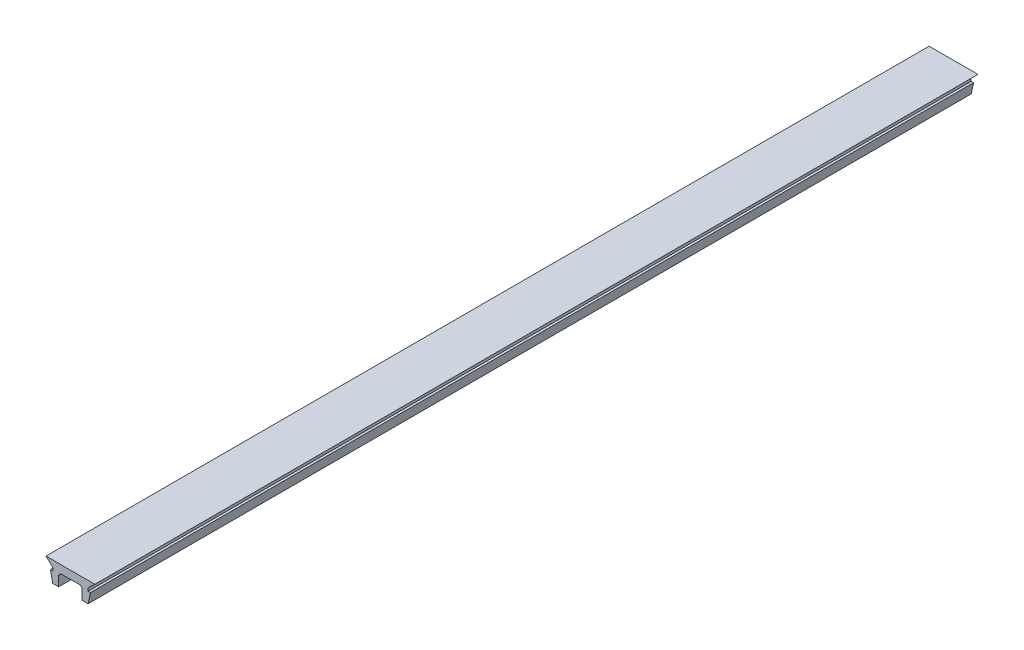
ISO-10303-21;
HEADER;
FILE_DESCRIPTION(('STEP AP214'),'2;1');
FILE_NAME('part.step','',(''),(''),'','','');
FILE_SCHEMA(('AUTOMOTIVE_DESIGN { 1 0 10303 214 1 1 1 1 }'));
ENDSEC;
DATA;
#1=APPLICATION_CONTEXT('core data for automotive mechanical design processes');
#2=APPLICATION_PROTOCOL_DEFINITION('international standard','automotive_design',2000,#1);
#3=PRODUCT_CONTEXT('',#1,'mechanical');
#4=PRODUCT('Part','Part','',(#3));
#5=PRODUCT_RELATED_PRODUCT_CATEGORY('part','',(#4));
#6=PRODUCT_DEFINITION_FORMATION('','',#4);
#7=PRODUCT_DEFINITION_CONTEXT('part definition',#1,'design');
#8=PRODUCT_DEFINITION('design','',#6,#7);
#9=PRODUCT_DEFINITION_SHAPE('','',#8);
#10=(LENGTH_UNIT() NAMED_UNIT(*) SI_UNIT(.MILLI.,.METRE.));
#11=(NAMED_UNIT(*) PLANE_ANGLE_UNIT() SI_UNIT($,.RADIAN.));
#12=(NAMED_UNIT(*) SI_UNIT($,.STERADIAN.) SOLID_ANGLE_UNIT());
#13=UNCERTAINTY_MEASURE_WITH_UNIT(LENGTH_MEASURE(1.E-05),#10,'distance_accuracy_value','');
#14=(GEOMETRIC_REPRESENTATION_CONTEXT(3) GLOBAL_UNCERTAINTY_ASSIGNED_CONTEXT((#13)) GLOBAL_UNIT_ASSIGNED_CONTEXT((#10,
#11,#12)) REPRESENTATION_CONTEXT('',''));
#15=CARTESIAN_POINT('',(0.,0.,0.));
#16=DIRECTION('',(0.,0.,1.));
#17=DIRECTION('',(1.,0.,0.));
#18=AXIS2_PLACEMENT_3D('',#15,#16,#17);
#19=CARTESIAN_POINT('',(-0.4,1.85,150.));
#20=DIRECTION('',(0.977414165439867,0.211332792527539,0.));
#21=DIRECTION('',(-0.211332792527539,0.977414165439867,0.));
#22=AXIS2_PLACEMENT_3D('',#19,#20,#21);
#23=PLANE('',#22);
#24=DIRECTION('',(0.211332792527539,-0.977414165439867,0.));
#25=VECTOR('',#24,1.);
#26=CARTESIAN_POINT('',(-0.4,1.85,0.));
#27=LINE('',#26,#25);
#28=CARTESIAN_POINT('',(-0.4,1.85,0.));
#29=VERTEX_POINT('',#28);
#30=CARTESIAN_POINT('',(0.,0.,0.));
#31=VERTEX_POINT('',#30);
#32=EDGE_CURVE('E188',#29,#31,#27,.T.);
#33=ORIENTED_EDGE('',*,*,#32,.T.);
#34=DIRECTION('',(0.,0.,-1.));
#35=VECTOR('',#34,1.);
#36=CARTESIAN_POINT('',(0.,0.,150.));
#37=LINE('',#36,#35);
#38=CARTESIAN_POINT('',(0.,0.,150.));
#39=VERTEX_POINT('',#38);
#40=EDGE_CURVE('E11',#39,#31,#37,.T.);
#41=ORIENTED_EDGE('',*,*,#40,.F.);
#42=DIRECTION('',(0.211332792527539,-0.977414165439867,0.));
#43=VECTOR('',#42,1.);
#44=CARTESIAN_POINT('',(-0.4,1.85,150.));
#45=LINE('',#44,#43);
#46=CARTESIAN_POINT('',(-0.4,1.85,150.));
#47=VERTEX_POINT('',#46);
#48=EDGE_CURVE('E235',#47,#39,#45,.T.);
#49=ORIENTED_EDGE('',*,*,#48,.F.);
#50=DIRECTION('',(0.,0.,-1.));
#51=VECTOR('',#50,1.);
#52=CARTESIAN_POINT('',(-0.4,1.85,150.));
#53=LINE('',#52,#51);
#54=EDGE_CURVE('E184',#47,#29,#53,.T.);
#55=ORIENTED_EDGE('',*,*,#54,.T.);
#56=EDGE_LOOP('',(#33,#41,#49,#55));
#57=FACE_BOUND('',#56,.T.);
#58=ADVANCED_FACE('F39',(#57),#23,.F.);
#59=CARTESIAN_POINT('',(0.,0.,150.));
#60=DIRECTION('',(0.,1.,0.));
#61=DIRECTION('',(0.,0.,1.));
#62=AXIS2_PLACEMENT_3D('',#59,#60,#61);
#63=PLANE('',#62);
#64=DIRECTION('',(1.,0.,0.));
#65=VECTOR('',#64,1.);
#66=CARTESIAN_POINT('',(0.,0.,0.));
#67=LINE('',#66,#65);
#68=CARTESIAN_POINT('',(1.,0.,0.));
#69=VERTEX_POINT('',#68);
#70=EDGE_CURVE('E192',#31,#69,#67,.T.);
#71=ORIENTED_EDGE('',*,*,#70,.T.);
#72=DIRECTION('',(0.,0.,-1.));
#73=VECTOR('',#72,1.);
#74=CARTESIAN_POINT('',(1.,0.,150.));
#75=LINE('',#74,#73);
#76=CARTESIAN_POINT('',(1.,0.,150.));
#77=VERTEX_POINT('',#76);
#78=EDGE_CURVE('E48',#77,#69,#75,.T.);
#79=ORIENTED_EDGE('',*,*,#78,.F.);
#80=DIRECTION('',(1.,0.,0.));
#81=VECTOR('',#80,1.);
#82=CARTESIAN_POINT('',(0.,0.,150.));
#83=LINE('',#82,#81);
#84=EDGE_CURVE('E123',#39,#77,#83,.T.);
#85=ORIENTED_EDGE('',*,*,#84,.F.);
#86=ORIENTED_EDGE('',*,*,#40,.T.);
#87=EDGE_LOOP('',(#71,#79,#85,#86));
#88=FACE_BOUND('',#87,.T.);
#89=ADVANCED_FACE('F356',(#88),#63,.F.);
#90=CARTESIAN_POINT('',(1.,0.,150.));
#91=DIRECTION('',(-1.,0.,0.));
#92=DIRECTION('',(0.,0.,1.));
#93=AXIS2_PLACEMENT_3D('',#90,#91,#92);
#94=PLANE('',#93);
#95=DIRECTION('',(0.,1.,0.));
#96=VECTOR('',#95,1.);
#97=CARTESIAN_POINT('',(1.,0.,0.));
#98=LINE('',#97,#96);
#99=CARTESIAN_POINT('',(1.,1.6,0.));
#100=VERTEX_POINT('',#99);
#101=EDGE_CURVE('E195',#69,#100,#98,.T.);
#102=ORIENTED_EDGE('',*,*,#101,.T.);
#103=DIRECTION('',(0.,0.,-1.));
#104=VECTOR('',#103,1.);
#105=CARTESIAN_POINT('',(1.,1.6,150.));
#106=LINE('',#105,#104);
#107=CARTESIAN_POINT('',(1.,1.6,150.));
#108=VERTEX_POINT('',#107);
#109=EDGE_CURVE('E278',#108,#100,#106,.T.);
#110=ORIENTED_EDGE('',*,*,#109,.F.);
#111=DIRECTION('',(0.,1.,0.));
#112=VECTOR('',#111,1.);
#113=CARTESIAN_POINT('',(1.,0.,150.));
#114=LINE('',#113,#112);
#115=EDGE_CURVE('E288',#77,#108,#114,.T.);
#116=ORIENTED_EDGE('',*,*,#115,.F.);
#117=ORIENTED_EDGE('',*,*,#78,.T.);
#118=EDGE_LOOP('',(#102,#110,#116,#117));
#119=FACE_BOUND('',#118,.T.);
#120=ADVANCED_FACE('F286',(#119),#94,.F.);
#121=CARTESIAN_POINT('',(1.5,1.6,150.));
#122=DIRECTION('',(0.,0.,-1.));
#123=DIRECTION('',(-1.,0.,0.));
#124=AXIS2_PLACEMENT_3D('',#121,#122,#123);
#125=CYLINDRICAL_SURFACE('',#124,0.5);
#126=CARTESIAN_POINT('',(1.5,1.6,0.));
#127=DIRECTION('',(0.,0.,-1.));
#128=DIRECTION('',(1.,0.,0.));
#129=AXIS2_PLACEMENT_3D('',#126,#127,#128);
#130=CIRCLE('',#129,0.5);
#131=CARTESIAN_POINT('',(1.5,2.1,0.));
#132=VERTEX_POINT('',#131);
#133=EDGE_CURVE('E198',#100,#132,#130,.T.);
#134=ORIENTED_EDGE('',*,*,#133,.T.);
#135=DIRECTION('',(0.,0.,-1.));
#136=VECTOR('',#135,1.);
#137=CARTESIAN_POINT('',(1.5,2.1,150.));
#138=LINE('',#137,#136);
#139=CARTESIAN_POINT('',(1.5,2.1,150.));
#140=VERTEX_POINT('',#139);
#141=EDGE_CURVE('E274',#140,#132,#138,.T.);
#142=ORIENTED_EDGE('',*,*,#141,.F.);
#143=CARTESIAN_POINT('',(1.5,1.6,150.));
#144=DIRECTION('',(0.,0.,-1.));
#145=DIRECTION('',(1.,0.,0.));
#146=AXIS2_PLACEMENT_3D('',#143,#144,#145);
#147=CIRCLE('',#146,0.5);
#148=EDGE_CURVE('E307',#108,#140,#147,.T.);
#149=ORIENTED_EDGE('',*,*,#148,.F.);
#150=ORIENTED_EDGE('',*,*,#109,.T.);
#151=EDGE_LOOP('',(#134,#142,#149,#150));
#152=FACE_BOUND('',#151,.T.);
#153=ADVANCED_FACE('F297',(#152),#125,.F.);
#154=CARTESIAN_POINT('',(1.5,2.1,150.));
#155=DIRECTION('',(0.,1.,0.));
#156=DIRECTION('',(0.,0.,1.));
#157=AXIS2_PLACEMENT_3D('',#154,#155,#156);
#158=PLANE('',#157);
#159=DIRECTION('',(1.,0.,0.));
#160=VECTOR('',#159,1.);
#161=CARTESIAN_POINT('',(1.5,2.1,0.));
#162=LINE('',#161,#160);
#163=CARTESIAN_POINT('',(4.5,2.1,0.));
#164=VERTEX_POINT('',#163);
#165=EDGE_CURVE('E201',#132,#164,#162,.T.);
#166=ORIENTED_EDGE('',*,*,#165,.T.);
#167=DIRECTION('',(0.,0.,-1.));
#168=VECTOR('',#167,1.);
#169=CARTESIAN_POINT('',(4.5,2.1,150.));
#170=LINE('',#169,#168);
#171=CARTESIAN_POINT('',(4.5,2.1,150.));
#172=VERTEX_POINT('',#171);
#173=EDGE_CURVE('E270',#172,#164,#170,.T.);
#174=ORIENTED_EDGE('',*,*,#173,.F.);
#175=DIRECTION('',(1.,0.,0.));
#176=VECTOR('',#175,1.);
#177=CARTESIAN_POINT('',(1.5,2.1,150.));
#178=LINE('',#177,#176);
#179=EDGE_CURVE('E303',#140,#172,#178,.T.);
#180=ORIENTED_EDGE('',*,*,#179,.F.);
#181=ORIENTED_EDGE('',*,*,#141,.T.);
#182=EDGE_LOOP('',(#166,#174,#180,#181));
#183=FACE_BOUND('',#182,.T.);
#184=ADVANCED_FACE('F301',(#183),#158,.F.);
#185=CARTESIAN_POINT('',(4.5,1.6,150.));
#186=DIRECTION('',(0.,0.,-1.));
#187=DIRECTION('',(-1.,0.,0.));
#188=AXIS2_PLACEMENT_3D('',#185,#186,#187);
#189=CYLINDRICAL_SURFACE('',#188,0.5);
#190=CARTESIAN_POINT('',(4.5,1.6,0.));
#191=DIRECTION('',(0.,0.,-1.));
#192=DIRECTION('',(-1.,0.,0.));
#193=AXIS2_PLACEMENT_3D('',#190,#191,#192);
#194=CIRCLE('',#193,0.5);
#195=CARTESIAN_POINT('',(5.,1.6,0.));
#196=VERTEX_POINT('',#195);
#197=EDGE_CURVE('E204',#164,#196,#194,.T.);
#198=ORIENTED_EDGE('',*,*,#197,.T.);
#199=DIRECTION('',(0.,0.,-1.));
#200=VECTOR('',#199,1.);
#201=CARTESIAN_POINT('',(5.,1.6,150.));
#202=LINE('',#201,#200);
#203=CARTESIAN_POINT('',(5.,1.6,150.));
#204=VERTEX_POINT('',#203);
#205=EDGE_CURVE('E266',#204,#196,#202,.T.);
#206=ORIENTED_EDGE('',*,*,#205,.F.);
#207=CARTESIAN_POINT('',(4.5,1.6,150.));
#208=DIRECTION('',(0.,0.,-1.));
#209=DIRECTION('',(-1.,0.,0.));
#210=AXIS2_PLACEMENT_3D('',#207,#208,#209);
#211=CIRCLE('',#210,0.5);
#212=EDGE_CURVE('E306',#172,#204,#211,.T.);
#213=ORIENTED_EDGE('',*,*,#212,.F.);
#214=ORIENTED_EDGE('',*,*,#173,.T.);
#215=EDGE_LOOP('',(#198,#206,#213,#214));
#216=FACE_BOUND('',#215,.T.);
#217=ADVANCED_FACE('F369',(#216),#189,.F.);
#218=CARTESIAN_POINT('',(5.,0.,150.));
#219=DIRECTION('',(1.,0.,0.));
#220=DIRECTION('',(0.,0.,-1.));
#221=AXIS2_PLACEMENT_3D('',#218,#219,#220);
#222=PLANE('',#221);
#223=DIRECTION('',(0.,-1.,0.));
#224=VECTOR('',#223,1.);
#225=CARTESIAN_POINT('',(5.,0.,0.));
#226=LINE('',#225,#224);
#227=CARTESIAN_POINT('',(5.,0.,0.));
#228=VERTEX_POINT('',#227);
#229=EDGE_CURVE('E207',#196,#228,#226,.T.);
#230=ORIENTED_EDGE('',*,*,#229,.T.);
#231=DIRECTION('',(0.,0.,-1.));
#232=VECTOR('',#231,1.);
#233=CARTESIAN_POINT('',(5.,0.,150.));
#234=LINE('',#233,#232);
#235=CARTESIAN_POINT('',(5.,0.,150.));
#236=VERTEX_POINT('',#235);
#237=EDGE_CURVE('E262',#236,#228,#234,.T.);
#238=ORIENTED_EDGE('',*,*,#237,.F.);
#239=DIRECTION('',(0.,-1.,0.));
#240=VECTOR('',#239,1.);
#241=CARTESIAN_POINT('',(5.,0.,150.));
#242=LINE('',#241,#240);
#243=EDGE_CURVE('E311',#204,#236,#242,.T.);
#244=ORIENTED_EDGE('',*,*,#243,.F.);
#245=ORIENTED_EDGE('',*,*,#205,.T.);
#246=EDGE_LOOP('',(#230,#238,#244,#245));
#247=FACE_BOUND('',#246,.T.);
#248=ADVANCED_FACE('F372',(#247),#222,.F.);
#249=CARTESIAN_POINT('',(5.,0.,150.));
#250=DIRECTION('',(0.,1.,0.));
#251=DIRECTION('',(0.,0.,1.));
#252=AXIS2_PLACEMENT_3D('',#249,#250,#251);
#253=PLANE('',#252);
#254=DIRECTION('',(1.,0.,0.));
#255=VECTOR('',#254,1.);
#256=CARTESIAN_POINT('',(5.,0.,0.));
#257=LINE('',#256,#255);
#258=CARTESIAN_POINT('',(6.,0.,0.));
#259=VERTEX_POINT('',#258);
#260=EDGE_CURVE('E210',#228,#259,#257,.T.);
#261=ORIENTED_EDGE('',*,*,#260,.T.);
#262=DIRECTION('',(0.,0.,-1.));
#263=VECTOR('',#262,1.);
#264=CARTESIAN_POINT('',(6.,0.,150.));
#265=LINE('',#264,#263);
#266=CARTESIAN_POINT('',(6.,0.,150.));
#267=VERTEX_POINT('',#266);
#268=EDGE_CURVE('E258',#267,#259,#265,.T.);
#269=ORIENTED_EDGE('',*,*,#268,.F.);
#270=DIRECTION('',(1.,0.,0.));
#271=VECTOR('',#270,1.);
#272=CARTESIAN_POINT('',(5.,0.,150.));
#273=LINE('',#272,#271);
#274=EDGE_CURVE('E318',#236,#267,#273,.T.);
#275=ORIENTED_EDGE('',*,*,#274,.F.);
#276=ORIENTED_EDGE('',*,*,#237,.T.);
#277=EDGE_LOOP('',(#261,#269,#275,#276));
#278=FACE_BOUND('',#277,.T.);
#279=ADVANCED_FACE('F376',(#278),#253,.F.);
#280=CARTESIAN_POINT('',(6.,0.,150.));
#281=DIRECTION('',(-0.977414165439867,0.211332792527539,0.));
#282=DIRECTION('',(-0.211332792527539,-0.977414165439867,0.));
#283=AXIS2_PLACEMENT_3D('',#280,#281,#282);
#284=PLANE('',#283);
#285=DIRECTION('',(0.211332792527539,0.977414165439867,0.));
#286=VECTOR('',#285,1.);
#287=CARTESIAN_POINT('',(6.,0.,0.));
#288=LINE('',#287,#286);
#289=CARTESIAN_POINT('',(6.4,1.85,0.));
#290=VERTEX_POINT('',#289);
#291=EDGE_CURVE('E213',#259,#290,#288,.T.);
#292=ORIENTED_EDGE('',*,*,#291,.T.);
#293=DIRECTION('',(0.,0.,-1.));
#294=VECTOR('',#293,1.);
#295=CARTESIAN_POINT('',(6.4,1.85,150.));
#296=LINE('',#295,#294);
#297=CARTESIAN_POINT('',(6.4,1.85,150.));
#298=VERTEX_POINT('',#297);
#299=EDGE_CURVE('E254',#298,#290,#296,.T.);
#300=ORIENTED_EDGE('',*,*,#299,.F.);
#301=DIRECTION('',(0.211332792527539,0.977414165439867,0.));
#302=VECTOR('',#301,1.);
#303=CARTESIAN_POINT('',(6.,0.,150.));
#304=LINE('',#303,#302);
#305=EDGE_CURVE('E321',#267,#298,#304,.T.);
#306=ORIENTED_EDGE('',*,*,#305,.F.);
#307=ORIENTED_EDGE('',*,*,#268,.T.);
#308=EDGE_LOOP('',(#292,#300,#306,#307));
#309=FACE_BOUND('',#308,.T.);
#310=ADVANCED_FACE('F380',(#309),#284,.F.);
#311=CARTESIAN_POINT('',(6.4,1.85,150.));
#312=DIRECTION('',(0.,-1.,0.));
#313=DIRECTION('',(1.,0.,0.));
#314=AXIS2_PLACEMENT_3D('',#311,#312,#313);
#315=PLANE('',#314);
#316=DIRECTION('',(-1.,0.,0.));
#317=VECTOR('',#316,1.);
#318=CARTESIAN_POINT('',(6.4,1.85,0.));
#319=LINE('',#318,#317);
#320=CARTESIAN_POINT('',(6.,1.85,0.));
#321=VERTEX_POINT('',#320);
#322=EDGE_CURVE('E216',#290,#321,#319,.T.);
#323=ORIENTED_EDGE('',*,*,#322,.T.);
#324=DIRECTION('',(0.,0.,-1.));
#325=VECTOR('',#324,1.);
#326=CARTESIAN_POINT('',(6.,1.85,150.));
#327=LINE('',#326,#325);
#328=CARTESIAN_POINT('',(6.,1.85,150.));
#329=VERTEX_POINT('',#328);
#330=EDGE_CURVE('E250',#329,#321,#327,.T.);
#331=ORIENTED_EDGE('',*,*,#330,.F.);
#332=DIRECTION('',(-1.,0.,0.));
#333=VECTOR('',#332,1.);
#334=CARTESIAN_POINT('',(6.4,1.85,150.));
#335=LINE('',#334,#333);
#336=EDGE_CURVE('E324',#298,#329,#335,.T.);
#337=ORIENTED_EDGE('',*,*,#336,.F.);
#338=ORIENTED_EDGE('',*,*,#299,.T.);
#339=EDGE_LOOP('',(#323,#331,#337,#338));
#340=FACE_BOUND('',#339,.T.);
#341=ADVANCED_FACE('F384',(#340),#315,.F.);
#342=CARTESIAN_POINT('',(6.,1.85,150.));
#343=DIRECTION('',(-1.,0.,0.));
#344=DIRECTION('',(0.,-1.,0.));
#345=AXIS2_PLACEMENT_3D('',#342,#343,#344);
#346=PLANE('',#345);
#347=DIRECTION('',(0.,1.,0.));
#348=VECTOR('',#347,1.);
#349=CARTESIAN_POINT('',(6.,1.85,0.));
#350=LINE('',#349,#348);
#351=CARTESIAN_POINT('',(6.,2.35,0.));
#352=VERTEX_POINT('',#351);
#353=EDGE_CURVE('E219',#321,#352,#350,.T.);
#354=ORIENTED_EDGE('',*,*,#353,.T.);
#355=DIRECTION('',(0.,0.,-1.));
#356=VECTOR('',#355,1.);
#357=CARTESIAN_POINT('',(6.,2.35,150.));
#358=LINE('',#357,#356);
#359=CARTESIAN_POINT('',(6.,2.35,150.));
#360=VERTEX_POINT('',#359);
#361=EDGE_CURVE('E246',#360,#352,#358,.T.);
#362=ORIENTED_EDGE('',*,*,#361,.F.);
#363=DIRECTION('',(0.,1.,0.));
#364=VECTOR('',#363,1.);
#365=CARTESIAN_POINT('',(6.,1.85,150.));
#366=LINE('',#365,#364);
#367=EDGE_CURVE('E327',#329,#360,#366,.T.);
#368=ORIENTED_EDGE('',*,*,#367,.F.);
#369=ORIENTED_EDGE('',*,*,#330,.T.);
#370=EDGE_LOOP('',(#354,#362,#368,#369));
#371=FACE_BOUND('',#370,.T.);
#372=ADVANCED_FACE('F388',(#371),#346,.F.);
#373=CARTESIAN_POINT('',(7.15,3.45,150.));
#374=DIRECTION('',(-0.691222645967364,0.722641857147699,0.));
#375=DIRECTION('',(-0.722641857147699,-0.691222645967364,0.));
#376=AXIS2_PLACEMENT_3D('',#373,#374,#375);
#377=PLANE('',#376);
#378=DIRECTION('',(0.722641857147699,0.691222645967364,0.));
#379=VECTOR('',#378,1.);
#380=CARTESIAN_POINT('',(7.15,3.45,0.));
#381=LINE('',#380,#379);
#382=CARTESIAN_POINT('',(7.15,3.45,0.));
#383=VERTEX_POINT('',#382);
#384=EDGE_CURVE('E222',#352,#383,#381,.T.);
#385=ORIENTED_EDGE('',*,*,#384,.T.);
#386=DIRECTION('',(0.,0.,-1.));
#387=VECTOR('',#386,1.);
#388=CARTESIAN_POINT('',(7.15,3.45,150.));
#389=LINE('',#388,#387);
#390=CARTESIAN_POINT('',(7.15,3.45,150.));
#391=VERTEX_POINT('',#390);
#392=EDGE_CURVE('E242',#391,#383,#389,.T.);
#393=ORIENTED_EDGE('',*,*,#392,.F.);
#394=DIRECTION('',(0.722641857147699,0.691222645967364,0.));
#395=VECTOR('',#394,1.);
#396=CARTESIAN_POINT('',(7.15,3.45,150.));
#397=LINE('',#396,#395);
#398=EDGE_CURVE('E330',#360,#391,#397,.T.);
#399=ORIENTED_EDGE('',*,*,#398,.F.);
#400=ORIENTED_EDGE('',*,*,#361,.T.);
#401=EDGE_LOOP('',(#385,#393,#399,#400));
#402=FACE_BOUND('',#401,.T.);
#403=ADVANCED_FACE('F338',(#402),#377,.F.);
#404=CARTESIAN_POINT('',(-1.15,3.45,150.));
#405=DIRECTION('',(0.,-1.,0.));
#406=DIRECTION('',(1.,0.,0.));
#407=AXIS2_PLACEMENT_3D('',#404,#405,#406);
#408=PLANE('',#407);
#409=DIRECTION('',(-1.,0.,0.));
#410=VECTOR('',#409,1.);
#411=CARTESIAN_POINT('',(-1.15,3.45,0.));
#412=LINE('',#411,#410);
#413=CARTESIAN_POINT('',(-1.15,3.45,0.));
#414=VERTEX_POINT('',#413);
#415=EDGE_CURVE('E226',#383,#414,#412,.T.);
#416=ORIENTED_EDGE('',*,*,#415,.T.);
#417=DIRECTION('',(0.,0.,-1.));
#418=VECTOR('',#417,1.);
#419=CARTESIAN_POINT('',(-1.15,3.45,150.));
#420=LINE('',#419,#418);
#421=CARTESIAN_POINT('',(-1.15,3.45,150.));
#422=VERTEX_POINT('',#421);
#423=EDGE_CURVE('E177',#422,#414,#420,.T.);
#424=ORIENTED_EDGE('',*,*,#423,.F.);
#425=DIRECTION('',(-1.,0.,0.));
#426=VECTOR('',#425,1.);
#427=CARTESIAN_POINT('',(6.,3.45,150.));
#428=LINE('',#427,#426);
#429=EDGE_CURVE('E166',#391,#422,#428,.T.);
#430=ORIENTED_EDGE('',*,*,#429,.F.);
#431=ORIENTED_EDGE('',*,*,#392,.T.);
#432=EDGE_LOOP('',(#416,#424,#430,#431));
#433=FACE_BOUND('',#432,.T.);
#434=ADVANCED_FACE('F341',(#433),#408,.F.);
#435=CARTESIAN_POINT('',(0.,2.35,150.));
#436=DIRECTION('',(0.691222645967365,0.722641857147699,0.));
#437=DIRECTION('',(-0.722641857147699,0.691222645967365,0.));
#438=AXIS2_PLACEMENT_3D('',#435,#436,#437);
#439=PLANE('',#438);
#440=DIRECTION('',(0.722641857147699,-0.691222645967365,0.));
#441=VECTOR('',#440,1.);
#442=CARTESIAN_POINT('',(0.,2.35,0.));
#443=LINE('',#442,#441);
#444=CARTESIAN_POINT('',(0.,2.35,0.));
#445=VERTEX_POINT('',#444);
#446=EDGE_CURVE('E175',#414,#445,#443,.T.);
#447=ORIENTED_EDGE('',*,*,#446,.T.);
#448=DIRECTION('',(0.,0.,-1.));
#449=VECTOR('',#448,1.);
#450=CARTESIAN_POINT('',(0.,2.35,150.));
#451=LINE('',#450,#449);
#452=CARTESIAN_POINT('',(0.,2.35,150.));
#453=VERTEX_POINT('',#452);
#454=EDGE_CURVE('E172',#453,#445,#451,.T.);
#455=ORIENTED_EDGE('',*,*,#454,.F.);
#456=DIRECTION('',(0.722641857147699,-0.691222645967365,0.));
#457=VECTOR('',#456,1.);
#458=CARTESIAN_POINT('',(0.,2.35,150.));
#459=LINE('',#458,#457);
#460=EDGE_CURVE('E160',#422,#453,#459,.T.);
#461=ORIENTED_EDGE('',*,*,#460,.F.);
#462=ORIENTED_EDGE('',*,*,#423,.T.);
#463=EDGE_LOOP('',(#447,#455,#461,#462));
#464=FACE_BOUND('',#463,.T.);
#465=ADVANCED_FACE('F173',(#464),#439,.F.);
#466=CARTESIAN_POINT('',(0.,1.85,150.));
#467=DIRECTION('',(1.,0.,0.));
#468=DIRECTION('',(0.,0.,-1.));
#469=AXIS2_PLACEMENT_3D('',#466,#467,#468);
#470=PLANE('',#469);
#471=DIRECTION('',(0.,-1.,0.));
#472=VECTOR('',#471,1.);
#473=CARTESIAN_POINT('',(0.,1.85,0.));
#474=LINE('',#473,#472);
#475=CARTESIAN_POINT('',(0.,1.85,0.));
#476=VERTEX_POINT('',#475);
#477=EDGE_CURVE('E109',#445,#476,#474,.T.);
#478=ORIENTED_EDGE('',*,*,#477,.T.);
#479=DIRECTION('',(0.,0.,-1.));
#480=VECTOR('',#479,1.);
#481=CARTESIAN_POINT('',(0.,1.85,150.));
#482=LINE('',#481,#480);
#483=CARTESIAN_POINT('',(0.,1.85,150.));
#484=VERTEX_POINT('',#483);
#485=EDGE_CURVE('E178',#484,#476,#482,.T.);
#486=ORIENTED_EDGE('',*,*,#485,.F.);
#487=DIRECTION('',(0.,-1.,0.));
#488=VECTOR('',#487,1.);
#489=CARTESIAN_POINT('',(0.,1.85,150.));
#490=LINE('',#489,#488);
#491=EDGE_CURVE('E164',#453,#484,#490,.T.);
#492=ORIENTED_EDGE('',*,*,#491,.F.);
#493=ORIENTED_EDGE('',*,*,#454,.T.);
#494=EDGE_LOOP('',(#478,#486,#492,#493));
#495=FACE_BOUND('',#494,.T.);
#496=ADVANCED_FACE('F180',(#495),#470,.F.);
#497=CARTESIAN_POINT('',(0.,1.85,150.));
#498=DIRECTION('',(0.,-1.,0.));
#499=DIRECTION('',(1.,0.,0.));
#500=AXIS2_PLACEMENT_3D('',#497,#498,#499);
#501=PLANE('',#500);
#502=DIRECTION('',(-1.,0.,0.));
#503=VECTOR('',#502,1.);
#504=CARTESIAN_POINT('',(0.,1.85,0.));
#505=LINE('',#504,#503);
#506=EDGE_CURVE('E115',#476,#29,#505,.T.);
#507=ORIENTED_EDGE('',*,*,#506,.T.);
#508=ORIENTED_EDGE('',*,*,#54,.F.);
#509=DIRECTION('',(-1.,0.,0.));
#510=VECTOR('',#509,1.);
#511=CARTESIAN_POINT('',(0.,1.85,150.));
#512=LINE('',#511,#510);
#513=EDGE_CURVE('E56',#484,#47,#512,.T.);
#514=ORIENTED_EDGE('',*,*,#513,.F.);
#515=ORIENTED_EDGE('',*,*,#485,.T.);
#516=EDGE_LOOP('',(#507,#508,#514,#515));
#517=FACE_BOUND('',#516,.T.);
#518=ADVANCED_FACE('F345',(#517),#501,.F.);
#519=CARTESIAN_POINT('',(1.5,1.6,150.));
#520=DIRECTION('',(0.,0.,1.));
#521=DIRECTION('',(1.,0.,0.));
#522=AXIS2_PLACEMENT_3D('',#519,#520,#521);
#523=PLANE('',#522);
#524=ORIENTED_EDGE('',*,*,#48,.T.);
#525=ORIENTED_EDGE('',*,*,#84,.T.);
#526=ORIENTED_EDGE('',*,*,#115,.T.);
#527=ORIENTED_EDGE('',*,*,#148,.T.);
#528=ORIENTED_EDGE('',*,*,#179,.T.);
#529=ORIENTED_EDGE('',*,*,#212,.T.);
#530=ORIENTED_EDGE('',*,*,#243,.T.);
#531=ORIENTED_EDGE('',*,*,#274,.T.);
#532=ORIENTED_EDGE('',*,*,#305,.T.);
#533=ORIENTED_EDGE('',*,*,#336,.T.);
#534=ORIENTED_EDGE('',*,*,#367,.T.);
#535=ORIENTED_EDGE('',*,*,#398,.T.);
#536=ORIENTED_EDGE('',*,*,#429,.T.);
#537=ORIENTED_EDGE('',*,*,#460,.T.);
#538=ORIENTED_EDGE('',*,*,#491,.T.);
#539=ORIENTED_EDGE('',*,*,#513,.T.);
#540=EDGE_LOOP('',(#524,#525,#526,#527,#528,#529,#530,#531,#532,#533,#534,#535,#536,#537,#538,#539));
#541=FACE_BOUND('',#540,.T.);
#542=ADVANCED_FACE('F162',(#541),#523,.T.);
#543=CARTESIAN_POINT('',(1.5,1.6,0.));
#544=DIRECTION('',(0.,0.,1.));
#545=DIRECTION('',(1.,0.,0.));
#546=AXIS2_PLACEMENT_3D('',#543,#544,#545);
#547=PLANE('',#546);
#548=ORIENTED_EDGE('',*,*,#32,.F.);
#549=ORIENTED_EDGE('',*,*,#506,.F.);
#550=ORIENTED_EDGE('',*,*,#477,.F.);
#551=ORIENTED_EDGE('',*,*,#446,.F.);
#552=ORIENTED_EDGE('',*,*,#415,.F.);
#553=ORIENTED_EDGE('',*,*,#384,.F.);
#554=ORIENTED_EDGE('',*,*,#353,.F.);
#555=ORIENTED_EDGE('',*,*,#322,.F.);
#556=ORIENTED_EDGE('',*,*,#291,.F.);
#557=ORIENTED_EDGE('',*,*,#260,.F.);
#558=ORIENTED_EDGE('',*,*,#229,.F.);
#559=ORIENTED_EDGE('',*,*,#197,.F.);
#560=ORIENTED_EDGE('',*,*,#165,.F.);
#561=ORIENTED_EDGE('',*,*,#133,.F.);
#562=ORIENTED_EDGE('',*,*,#101,.F.);
#563=ORIENTED_EDGE('',*,*,#70,.F.);
#564=EDGE_LOOP('',(#548,#549,#550,#551,#552,#553,#554,#555,#556,#557,#558,#559,#560,#561,#562,#563));
#565=FACE_BOUND('',#564,.T.);
#566=ADVANCED_FACE('F292',(#565),#547,.F.);
#567=CLOSED_SHELL('',(#58,#89,#120,#153,#184,#217,#248,#279,#310,#341,#372,#403,#434,#465,#496,
#518,#542,#566));
#568=MANIFOLD_SOLID_BREP('B2',#567);
#569=ADVANCED_BREP_SHAPE_REPRESENTATION('',(#18,#568),#14);
#570=SHAPE_DEFINITION_REPRESENTATION(#9,#569);
ENDSEC;
END-ISO-10303-21;
